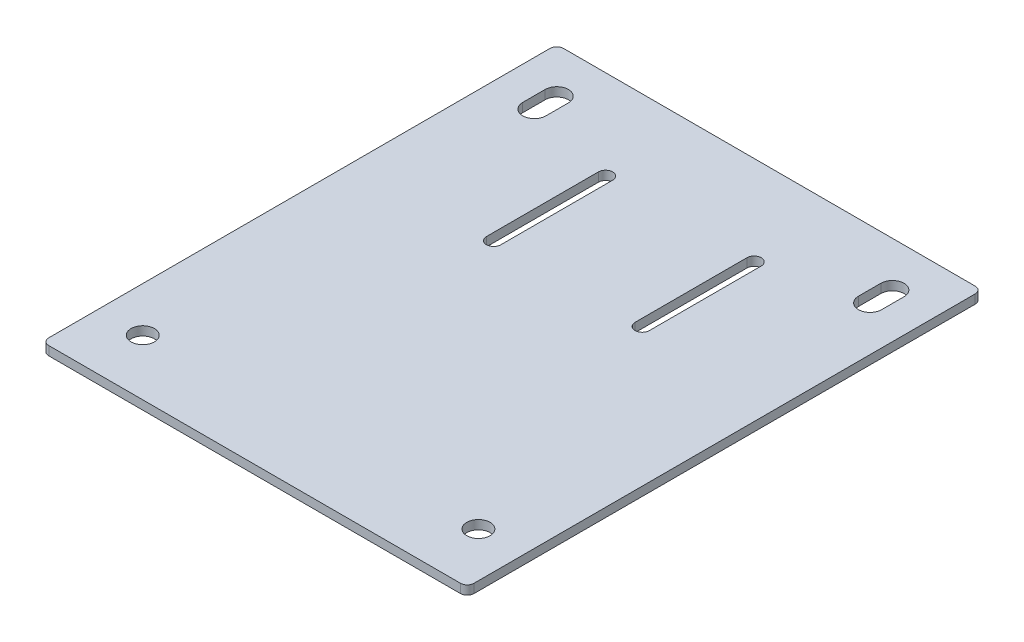
ISO-10303-21;
HEADER;
FILE_DESCRIPTION(('STEP AP214'),'2;1');
FILE_NAME('part.step','',(''),(''),'','','');
FILE_SCHEMA(('AUTOMOTIVE_DESIGN { 1 0 10303 214 1 1 1 1 }'));
ENDSEC;
DATA;
#1=APPLICATION_CONTEXT('core data for automotive mechanical design processes');
#2=APPLICATION_PROTOCOL_DEFINITION('international standard','automotive_design',2000,#1);
#3=PRODUCT_CONTEXT('',#1,'mechanical');
#4=PRODUCT('Part','Part','',(#3));
#5=PRODUCT_RELATED_PRODUCT_CATEGORY('part','',(#4));
#6=PRODUCT_DEFINITION_FORMATION('','',#4);
#7=PRODUCT_DEFINITION_CONTEXT('part definition',#1,'design');
#8=PRODUCT_DEFINITION('design','',#6,#7);
#9=PRODUCT_DEFINITION_SHAPE('','',#8);
#10=(LENGTH_UNIT() NAMED_UNIT(*) SI_UNIT(.MILLI.,.METRE.));
#11=(NAMED_UNIT(*) PLANE_ANGLE_UNIT() SI_UNIT($,.RADIAN.));
#12=(NAMED_UNIT(*) SI_UNIT($,.STERADIAN.) SOLID_ANGLE_UNIT());
#13=UNCERTAINTY_MEASURE_WITH_UNIT(LENGTH_MEASURE(1.E-05),#10,'distance_accuracy_value','');
#14=(GEOMETRIC_REPRESENTATION_CONTEXT(3) GLOBAL_UNCERTAINTY_ASSIGNED_CONTEXT((#13)) GLOBAL_UNIT_ASSIGNED_CONTEXT((#10,
#11,#12)) REPRESENTATION_CONTEXT('',''));
#15=CARTESIAN_POINT('',(0.,0.,0.));
#16=DIRECTION('',(0.,0.,1.));
#17=DIRECTION('',(1.,0.,0.));
#18=AXIS2_PLACEMENT_3D('',#15,#16,#17);
#19=CARTESIAN_POINT('',(0.,2.,0.));
#20=DIRECTION('',(0.,-1.,0.));
#21=DIRECTION('',(0.,0.,-1.));
#22=AXIS2_PLACEMENT_3D('',#19,#20,#21);
#23=PLANE('',#22);
#24=DIRECTION('',(0.,0.,-1.));
#25=VECTOR('',#24,1.);
#26=CARTESIAN_POINT('',(-18.2,2.,-37.5));
#27=LINE('',#26,#25);
#28=CARTESIAN_POINT('',(-18.2,2.,-12.5));
#29=VERTEX_POINT('',#28);
#30=CARTESIAN_POINT('',(-18.2,2.,-37.5));
#31=VERTEX_POINT('',#30);
#32=EDGE_CURVE('E202',#29,#31,#27,.T.);
#33=ORIENTED_EDGE('',*,*,#32,.T.);
#34=CARTESIAN_POINT('',(-16.6,2.,-37.5));
#35=DIRECTION('',(0.,-1.,0.));
#36=DIRECTION('',(0.,0.,1.));
#37=AXIS2_PLACEMENT_3D('',#34,#35,#36);
#38=CIRCLE('',#37,1.6);
#39=CARTESIAN_POINT('',(-15.,2.,-37.5));
#40=VERTEX_POINT('',#39);
#41=EDGE_CURVE('E196',#31,#40,#38,.T.);
#42=ORIENTED_EDGE('',*,*,#41,.T.);
#43=DIRECTION('',(0.,0.,1.));
#44=VECTOR('',#43,1.);
#45=CARTESIAN_POINT('',(-15.,2.,-37.5));
#46=LINE('',#45,#44);
#47=CARTESIAN_POINT('',(-15.,2.,-12.5));
#48=VERTEX_POINT('',#47);
#49=EDGE_CURVE('E205',#40,#48,#46,.T.);
#50=ORIENTED_EDGE('',*,*,#49,.T.);
#51=CARTESIAN_POINT('',(-16.6,2.,-12.5));
#52=DIRECTION('',(0.,-1.,0.));
#53=DIRECTION('',(0.,0.,1.));
#54=AXIS2_PLACEMENT_3D('',#51,#52,#53);
#55=CIRCLE('',#54,1.6);
#56=EDGE_CURVE('E48',#48,#29,#55,.T.);
#57=ORIENTED_EDGE('',*,*,#56,.T.);
#58=EDGE_LOOP('',(#33,#42,#50,#57));
#59=FACE_BOUND('',#58,.T.);
#60=DIRECTION('',(0.,0.,-1.));
#61=VECTOR('',#60,1.);
#62=CARTESIAN_POINT('',(15.,2.,-37.5));
#63=LINE('',#62,#61);
#64=CARTESIAN_POINT('',(15.,2.,-12.5));
#65=VERTEX_POINT('',#64);
#66=CARTESIAN_POINT('',(15.,2.,-37.5));
#67=VERTEX_POINT('',#66);
#68=EDGE_CURVE('E240',#65,#67,#63,.T.);
#69=ORIENTED_EDGE('',*,*,#68,.T.);
#70=CARTESIAN_POINT('',(16.6,2.,-37.5));
#71=DIRECTION('',(0.,-1.,0.));
#72=DIRECTION('',(0.,0.,-1.));
#73=AXIS2_PLACEMENT_3D('',#70,#71,#72);
#74=CIRCLE('',#73,1.6);
#75=CARTESIAN_POINT('',(18.2,2.,-37.5));
#76=VERTEX_POINT('',#75);
#77=EDGE_CURVE('E230',#67,#76,#74,.T.);
#78=ORIENTED_EDGE('',*,*,#77,.T.);
#79=DIRECTION('',(0.,0.,1.));
#80=VECTOR('',#79,1.);
#81=CARTESIAN_POINT('',(18.2,2.,-37.5));
#82=LINE('',#81,#80);
#83=CARTESIAN_POINT('',(18.2,2.,-12.5));
#84=VERTEX_POINT('',#83);
#85=EDGE_CURVE('E233',#76,#84,#82,.T.);
#86=ORIENTED_EDGE('',*,*,#85,.T.);
#87=CARTESIAN_POINT('',(16.6,2.,-12.5));
#88=DIRECTION('',(0.,-1.,0.));
#89=DIRECTION('',(0.,0.,-1.));
#90=AXIS2_PLACEMENT_3D('',#87,#88,#89);
#91=CIRCLE('',#90,1.6);
#92=EDGE_CURVE('E237',#84,#65,#91,.T.);
#93=ORIENTED_EDGE('',*,*,#92,.T.);
#94=EDGE_LOOP('',(#69,#78,#86,#93));
#95=FACE_BOUND('',#94,.T.);
#96=DIRECTION('',(1.,0.,0.));
#97=VECTOR('',#96,1.);
#98=CARTESIAN_POINT('',(-47.5,2.,57.5));
#99=LINE('',#98,#97);
#100=CARTESIAN_POINT('',(-46.,2.,57.5));
#101=VERTEX_POINT('',#100);
#102=CARTESIAN_POINT('',(46.,2.,57.5));
#103=VERTEX_POINT('',#102);
#104=EDGE_CURVE('E350',#101,#103,#99,.T.);
#105=ORIENTED_EDGE('',*,*,#104,.T.);
#106=CARTESIAN_POINT('',(46.,2.,56.));
#107=DIRECTION('',(0.,-1.,0.));
#108=DIRECTION('',(0.,0.,-1.));
#109=AXIS2_PLACEMENT_3D('',#106,#107,#108);
#110=CIRCLE('',#109,1.5);
#111=CARTESIAN_POINT('',(47.5,2.,56.));
#112=VERTEX_POINT('',#111);
#113=EDGE_CURVE('E387',#103,#112,#110,.F.);
#114=ORIENTED_EDGE('',*,*,#113,.T.);
#115=DIRECTION('',(0.,0.,-1.));
#116=VECTOR('',#115,1.);
#117=CARTESIAN_POINT('',(47.5,2.,57.5));
#118=LINE('',#117,#116);
#119=CARTESIAN_POINT('',(47.5,2.,-56.));
#120=VERTEX_POINT('',#119);
#121=EDGE_CURVE('E340',#112,#120,#118,.T.);
#122=ORIENTED_EDGE('',*,*,#121,.T.);
#123=CARTESIAN_POINT('',(46.,2.,-56.));
#124=DIRECTION('',(0.,-1.,0.));
#125=DIRECTION('',(0.,0.,-1.));
#126=AXIS2_PLACEMENT_3D('',#123,#124,#125);
#127=CIRCLE('',#126,1.5);
#128=CARTESIAN_POINT('',(46.,2.,-57.5));
#129=VERTEX_POINT('',#128);
#130=EDGE_CURVE('E383',#120,#129,#127,.F.);
#131=ORIENTED_EDGE('',*,*,#130,.T.);
#132=DIRECTION('',(-1.,0.,0.));
#133=VECTOR('',#132,1.);
#134=CARTESIAN_POINT('',(-47.5,2.,-57.5));
#135=LINE('',#134,#133);
#136=CARTESIAN_POINT('',(-46.,2.,-57.5));
#137=VERTEX_POINT('',#136);
#138=EDGE_CURVE('E343',#129,#137,#135,.T.);
#139=ORIENTED_EDGE('',*,*,#138,.T.);
#140=CARTESIAN_POINT('',(-46.,2.,-56.));
#141=DIRECTION('',(0.,-1.,0.));
#142=DIRECTION('',(0.,0.,-1.));
#143=AXIS2_PLACEMENT_3D('',#140,#141,#142);
#144=CIRCLE('',#143,1.5);
#145=CARTESIAN_POINT('',(-47.5,2.,-56.));
#146=VERTEX_POINT('',#145);
#147=EDGE_CURVE('E381',#137,#146,#144,.F.);
#148=ORIENTED_EDGE('',*,*,#147,.T.);
#149=DIRECTION('',(0.,0.,1.));
#150=VECTOR('',#149,1.);
#151=CARTESIAN_POINT('',(-47.5,2.,57.5));
#152=LINE('',#151,#150);
#153=CARTESIAN_POINT('',(-47.5,2.,56.));
#154=VERTEX_POINT('',#153);
#155=EDGE_CURVE('E347',#146,#154,#152,.T.);
#156=ORIENTED_EDGE('',*,*,#155,.T.);
#157=CARTESIAN_POINT('',(-46.,2.,56.));
#158=DIRECTION('',(0.,-1.,0.));
#159=DIRECTION('',(0.,0.,-1.));
#160=AXIS2_PLACEMENT_3D('',#157,#158,#159);
#161=CIRCLE('',#160,1.5);
#162=EDGE_CURVE('E385',#154,#101,#161,.F.);
#163=ORIENTED_EDGE('',*,*,#162,.T.);
#164=EDGE_LOOP('',(#105,#114,#122,#131,#139,#148,#156,#163));
#165=FACE_BOUND('',#164,.T.);
#166=DIRECTION('',(0.,0.,1.));
#167=VECTOR('',#166,1.);
#168=CARTESIAN_POINT('',(-40.1,2.,-47.5));
#169=LINE('',#168,#167);
#170=CARTESIAN_POINT('',(-40.1,2.,-47.5));
#171=VERTEX_POINT('',#170);
#172=CARTESIAN_POINT('',(-40.1,2.,-42.5));
#173=VERTEX_POINT('',#172);
#174=EDGE_CURVE('E310',#171,#173,#169,.T.);
#175=ORIENTED_EDGE('',*,*,#174,.F.);
#176=CARTESIAN_POINT('',(-37.5,2.,-47.5));
#177=DIRECTION('',(0.,1.,0.));
#178=DIRECTION('',(0.,0.,1.));
#179=AXIS2_PLACEMENT_3D('',#176,#177,#178);
#180=CIRCLE('',#179,2.6);
#181=CARTESIAN_POINT('',(-34.9,2.,-47.5));
#182=VERTEX_POINT('',#181);
#183=EDGE_CURVE('E287',#182,#171,#180,.T.);
#184=ORIENTED_EDGE('',*,*,#183,.F.);
#185=DIRECTION('',(0.,0.,-1.));
#186=VECTOR('',#185,1.);
#187=CARTESIAN_POINT('',(-34.9,2.,-47.5));
#188=LINE('',#187,#186);
#189=CARTESIAN_POINT('',(-34.9,2.,-42.5));
#190=VERTEX_POINT('',#189);
#191=EDGE_CURVE('E299',#190,#182,#188,.T.);
#192=ORIENTED_EDGE('',*,*,#191,.F.);
#193=CARTESIAN_POINT('',(-37.5,2.,-42.5));
#194=DIRECTION('',(0.,1.,0.));
#195=DIRECTION('',(0.,0.,1.));
#196=AXIS2_PLACEMENT_3D('',#193,#194,#195);
#197=CIRCLE('',#196,2.6);
#198=EDGE_CURVE('E312',#173,#190,#197,.T.);
#199=ORIENTED_EDGE('',*,*,#198,.F.);
#200=EDGE_LOOP('',(#175,#184,#192,#199));
#201=FACE_BOUND('',#200,.T.);
#202=DIRECTION('',(0.,0.,1.));
#203=VECTOR('',#202,1.);
#204=CARTESIAN_POINT('',(34.9,2.,-47.5));
#205=LINE('',#204,#203);
#206=CARTESIAN_POINT('',(34.9,2.,-47.5));
#207=VERTEX_POINT('',#206);
#208=CARTESIAN_POINT('',(34.9,2.,-42.5));
#209=VERTEX_POINT('',#208);
#210=EDGE_CURVE('E278',#207,#209,#205,.T.);
#211=ORIENTED_EDGE('',*,*,#210,.F.);
#212=CARTESIAN_POINT('',(37.5,2.,-47.5));
#213=DIRECTION('',(0.,1.,0.));
#214=DIRECTION('',(0.,0.,-1.));
#215=AXIS2_PLACEMENT_3D('',#212,#213,#214);
#216=CIRCLE('',#215,2.6);
#217=CARTESIAN_POINT('',(40.1,2.,-47.5));
#218=VERTEX_POINT('',#217);
#219=EDGE_CURVE('E255',#218,#207,#216,.T.);
#220=ORIENTED_EDGE('',*,*,#219,.F.);
#221=DIRECTION('',(0.,0.,-1.));
#222=VECTOR('',#221,1.);
#223=CARTESIAN_POINT('',(40.1,2.,-47.5));
#224=LINE('',#223,#222);
#225=CARTESIAN_POINT('',(40.1,2.,-42.5));
#226=VERTEX_POINT('',#225);
#227=EDGE_CURVE('E266',#226,#218,#224,.T.);
#228=ORIENTED_EDGE('',*,*,#227,.F.);
#229=CARTESIAN_POINT('',(37.5,2.,-42.5));
#230=DIRECTION('',(0.,1.,0.));
#231=DIRECTION('',(0.,0.,-1.));
#232=AXIS2_PLACEMENT_3D('',#229,#230,#231);
#233=CIRCLE('',#232,2.6);
#234=EDGE_CURVE('E280',#209,#226,#233,.T.);
#235=ORIENTED_EDGE('',*,*,#234,.F.);
#236=EDGE_LOOP('',(#211,#220,#228,#235));
#237=FACE_BOUND('',#236,.T.);
#238=CARTESIAN_POINT('',(37.5,2.,45.));
#239=DIRECTION('',(0.,1.,0.));
#240=DIRECTION('',(0.,0.,1.));
#241=AXIS2_PLACEMENT_3D('',#238,#239,#240);
#242=CIRCLE('',#241,2.6);
#243=CARTESIAN_POINT('',(37.5,2.,47.6));
#244=VERTEX_POINT('',#243);
#245=EDGE_CURVE('E334',#244,#244,#242,.T.);
#246=ORIENTED_EDGE('',*,*,#245,.F.);
#247=EDGE_LOOP('',(#246));
#248=FACE_BOUND('',#247,.T.);
#249=CARTESIAN_POINT('',(-37.5,2.,45.));
#250=DIRECTION('',(0.,1.,0.));
#251=DIRECTION('',(0.,0.,-1.));
#252=AXIS2_PLACEMENT_3D('',#249,#250,#251);
#253=CIRCLE('',#252,2.6);
#254=CARTESIAN_POINT('',(-37.5,2.,42.4));
#255=VERTEX_POINT('',#254);
#256=EDGE_CURVE('E328',#255,#255,#253,.T.);
#257=ORIENTED_EDGE('',*,*,#256,.F.);
#258=EDGE_LOOP('',(#257));
#259=FACE_BOUND('',#258,.T.);
#260=ADVANCED_FACE('F33',(#59,#95,#165,#201,#237,#248,#259),#23,.F.);
#261=CARTESIAN_POINT('',(0.,0.,0.));
#262=DIRECTION('',(0.,-1.,0.));
#263=DIRECTION('',(0.,0.,-1.));
#264=AXIS2_PLACEMENT_3D('',#261,#262,#263);
#265=PLANE('',#264);
#266=CARTESIAN_POINT('',(-16.6,0.,-37.5));
#267=DIRECTION('',(0.,-1.,0.));
#268=DIRECTION('',(0.,0.,1.));
#269=AXIS2_PLACEMENT_3D('',#266,#267,#268);
#270=CIRCLE('',#269,1.6);
#271=CARTESIAN_POINT('',(-18.2,0.,-37.5));
#272=VERTEX_POINT('',#271);
#273=CARTESIAN_POINT('',(-15.,0.,-37.5));
#274=VERTEX_POINT('',#273);
#275=EDGE_CURVE('E56',#272,#274,#270,.T.);
#276=ORIENTED_EDGE('',*,*,#275,.F.);
#277=DIRECTION('',(0.,0.,-1.));
#278=VECTOR('',#277,1.);
#279=CARTESIAN_POINT('',(-18.2,0.,-37.5));
#280=LINE('',#279,#278);
#281=CARTESIAN_POINT('',(-18.2,0.,-12.5));
#282=VERTEX_POINT('',#281);
#283=EDGE_CURVE('E211',#282,#272,#280,.T.);
#284=ORIENTED_EDGE('',*,*,#283,.F.);
#285=CARTESIAN_POINT('',(-16.6,0.,-12.5));
#286=DIRECTION('',(0.,-1.,0.));
#287=DIRECTION('',(0.,0.,1.));
#288=AXIS2_PLACEMENT_3D('',#285,#286,#287);
#289=CIRCLE('',#288,1.6);
#290=CARTESIAN_POINT('',(-15.,0.,-12.5));
#291=VERTEX_POINT('',#290);
#292=EDGE_CURVE('E214',#291,#282,#289,.T.);
#293=ORIENTED_EDGE('',*,*,#292,.F.);
#294=DIRECTION('',(0.,0.,1.));
#295=VECTOR('',#294,1.);
#296=CARTESIAN_POINT('',(-15.,0.,-37.5));
#297=LINE('',#296,#295);
#298=EDGE_CURVE('E220',#274,#291,#297,.T.);
#299=ORIENTED_EDGE('',*,*,#298,.F.);
#300=EDGE_LOOP('',(#276,#284,#293,#299));
#301=FACE_BOUND('',#300,.T.);
#302=CARTESIAN_POINT('',(16.6,0.,-37.5));
#303=DIRECTION('',(0.,-1.,0.));
#304=DIRECTION('',(0.,0.,-1.));
#305=AXIS2_PLACEMENT_3D('',#302,#303,#304);
#306=CIRCLE('',#305,1.6);
#307=CARTESIAN_POINT('',(15.,0.,-37.5));
#308=VERTEX_POINT('',#307);
#309=CARTESIAN_POINT('',(18.2,0.,-37.5));
#310=VERTEX_POINT('',#309);
#311=EDGE_CURVE('E226',#308,#310,#306,.T.);
#312=ORIENTED_EDGE('',*,*,#311,.F.);
#313=DIRECTION('',(0.,0.,-1.));
#314=VECTOR('',#313,1.);
#315=CARTESIAN_POINT('',(15.,0.,-37.5));
#316=LINE('',#315,#314);
#317=CARTESIAN_POINT('',(15.,0.,-12.5));
#318=VERTEX_POINT('',#317);
#319=EDGE_CURVE('E234',#318,#308,#316,.T.);
#320=ORIENTED_EDGE('',*,*,#319,.F.);
#321=CARTESIAN_POINT('',(16.6,0.,-12.5));
#322=DIRECTION('',(0.,-1.,0.));
#323=DIRECTION('',(0.,0.,-1.));
#324=AXIS2_PLACEMENT_3D('',#321,#322,#323);
#325=CIRCLE('',#324,1.6);
#326=CARTESIAN_POINT('',(18.2,0.,-12.5));
#327=VERTEX_POINT('',#326);
#328=EDGE_CURVE('E248',#327,#318,#325,.T.);
#329=ORIENTED_EDGE('',*,*,#328,.F.);
#330=DIRECTION('',(0.,0.,1.));
#331=VECTOR('',#330,1.);
#332=CARTESIAN_POINT('',(18.2,0.,-37.5));
#333=LINE('',#332,#331);
#334=EDGE_CURVE('E245',#310,#327,#333,.T.);
#335=ORIENTED_EDGE('',*,*,#334,.F.);
#336=EDGE_LOOP('',(#312,#320,#329,#335));
#337=FACE_BOUND('',#336,.T.);
#338=CARTESIAN_POINT('',(37.5,0.,-47.5));
#339=DIRECTION('',(0.,1.,0.));
#340=DIRECTION('',(0.,0.,-1.));
#341=AXIS2_PLACEMENT_3D('',#338,#339,#340);
#342=CIRCLE('',#341,2.6);
#343=CARTESIAN_POINT('',(40.1,0.,-47.5));
#344=VERTEX_POINT('',#343);
#345=CARTESIAN_POINT('',(34.9,0.,-47.5));
#346=VERTEX_POINT('',#345);
#347=EDGE_CURVE('E262',#344,#346,#342,.T.);
#348=ORIENTED_EDGE('',*,*,#347,.T.);
#349=DIRECTION('',(0.,0.,1.));
#350=VECTOR('',#349,1.);
#351=CARTESIAN_POINT('',(34.9,0.,-47.5));
#352=LINE('',#351,#350);
#353=CARTESIAN_POINT('',(34.9,0.,-42.5));
#354=VERTEX_POINT('',#353);
#355=EDGE_CURVE('E265',#346,#354,#352,.T.);
#356=ORIENTED_EDGE('',*,*,#355,.T.);
#357=CARTESIAN_POINT('',(37.5,0.,-42.5));
#358=DIRECTION('',(0.,1.,0.));
#359=DIRECTION('',(0.,0.,-1.));
#360=AXIS2_PLACEMENT_3D('',#357,#358,#359);
#361=CIRCLE('',#360,2.6);
#362=CARTESIAN_POINT('',(40.1,0.,-42.5));
#363=VERTEX_POINT('',#362);
#364=EDGE_CURVE('E269',#354,#363,#361,.T.);
#365=ORIENTED_EDGE('',*,*,#364,.T.);
#366=DIRECTION('',(0.,0.,-1.));
#367=VECTOR('',#366,1.);
#368=CARTESIAN_POINT('',(40.1,0.,-47.5));
#369=LINE('',#368,#367);
#370=EDGE_CURVE('E272',#363,#344,#369,.T.);
#371=ORIENTED_EDGE('',*,*,#370,.T.);
#372=EDGE_LOOP('',(#348,#356,#365,#371));
#373=FACE_BOUND('',#372,.T.);
#374=CARTESIAN_POINT('',(-37.5,0.,-47.5));
#375=DIRECTION('',(0.,1.,0.));
#376=DIRECTION('',(0.,0.,1.));
#377=AXIS2_PLACEMENT_3D('',#374,#375,#376);
#378=CIRCLE('',#377,2.6);
#379=CARTESIAN_POINT('',(-34.9,0.,-47.5));
#380=VERTEX_POINT('',#379);
#381=CARTESIAN_POINT('',(-40.1,0.,-47.5));
#382=VERTEX_POINT('',#381);
#383=EDGE_CURVE('E295',#380,#382,#378,.T.);
#384=ORIENTED_EDGE('',*,*,#383,.T.);
#385=DIRECTION('',(0.,0.,1.));
#386=VECTOR('',#385,1.);
#387=CARTESIAN_POINT('',(-40.1,0.,-47.5));
#388=LINE('',#387,#386);
#389=CARTESIAN_POINT('',(-40.1,0.,-42.5));
#390=VERTEX_POINT('',#389);
#391=EDGE_CURVE('E298',#382,#390,#388,.T.);
#392=ORIENTED_EDGE('',*,*,#391,.T.);
#393=CARTESIAN_POINT('',(-37.5,0.,-42.5));
#394=DIRECTION('',(0.,1.,0.));
#395=DIRECTION('',(0.,0.,1.));
#396=AXIS2_PLACEMENT_3D('',#393,#394,#395);
#397=CIRCLE('',#396,2.6);
#398=CARTESIAN_POINT('',(-34.9,0.,-42.5));
#399=VERTEX_POINT('',#398);
#400=EDGE_CURVE('E302',#390,#399,#397,.T.);
#401=ORIENTED_EDGE('',*,*,#400,.T.);
#402=DIRECTION('',(0.,0.,-1.));
#403=VECTOR('',#402,1.);
#404=CARTESIAN_POINT('',(-34.9,0.,-47.5));
#405=LINE('',#404,#403);
#406=EDGE_CURVE('E305',#399,#380,#405,.T.);
#407=ORIENTED_EDGE('',*,*,#406,.T.);
#408=EDGE_LOOP('',(#384,#392,#401,#407));
#409=FACE_BOUND('',#408,.T.);
#410=CARTESIAN_POINT('',(37.5,0.,45.));
#411=DIRECTION('',(0.,1.,0.));
#412=DIRECTION('',(0.,0.,1.));
#413=AXIS2_PLACEMENT_3D('',#410,#411,#412);
#414=CIRCLE('',#413,2.6);
#415=CARTESIAN_POINT('',(37.5,0.,47.6));
#416=VERTEX_POINT('',#415);
#417=EDGE_CURVE('E331',#416,#416,#414,.T.);
#418=ORIENTED_EDGE('',*,*,#417,.T.);
#419=EDGE_LOOP('',(#418));
#420=FACE_BOUND('',#419,.T.);
#421=DIRECTION('',(0.,0.,-1.));
#422=VECTOR('',#421,1.);
#423=CARTESIAN_POINT('',(47.5,0.,57.5));
#424=LINE('',#423,#422);
#425=CARTESIAN_POINT('',(47.5,0.,56.));
#426=VERTEX_POINT('',#425);
#427=CARTESIAN_POINT('',(47.5,0.,-56.));
#428=VERTEX_POINT('',#427);
#429=EDGE_CURVE('E337',#426,#428,#424,.T.);
#430=ORIENTED_EDGE('',*,*,#429,.F.);
#431=CARTESIAN_POINT('',(46.,0.,56.));
#432=DIRECTION('',(0.,-1.,0.));
#433=DIRECTION('',(0.,0.,-1.));
#434=AXIS2_PLACEMENT_3D('',#431,#432,#433);
#435=CIRCLE('',#434,1.5);
#436=CARTESIAN_POINT('',(46.,0.,57.5));
#437=VERTEX_POINT('',#436);
#438=EDGE_CURVE('E374',#426,#437,#435,.T.);
#439=ORIENTED_EDGE('',*,*,#438,.T.);
#440=DIRECTION('',(1.,0.,0.));
#441=VECTOR('',#440,1.);
#442=CARTESIAN_POINT('',(-47.5,0.,57.5));
#443=LINE('',#442,#441);
#444=CARTESIAN_POINT('',(-46.,0.,57.5));
#445=VERTEX_POINT('',#444);
#446=EDGE_CURVE('E344',#445,#437,#443,.T.);
#447=ORIENTED_EDGE('',*,*,#446,.F.);
#448=CARTESIAN_POINT('',(-46.,0.,56.));
#449=DIRECTION('',(0.,-1.,0.));
#450=DIRECTION('',(0.,0.,-1.));
#451=AXIS2_PLACEMENT_3D('',#448,#449,#450);
#452=CIRCLE('',#451,1.5);
#453=CARTESIAN_POINT('',(-47.5,0.,56.));
#454=VERTEX_POINT('',#453);
#455=EDGE_CURVE('E372',#445,#454,#452,.T.);
#456=ORIENTED_EDGE('',*,*,#455,.T.);
#457=DIRECTION('',(0.,0.,1.));
#458=VECTOR('',#457,1.);
#459=CARTESIAN_POINT('',(-47.5,0.,57.5));
#460=LINE('',#459,#458);
#461=CARTESIAN_POINT('',(-47.5,0.,-56.));
#462=VERTEX_POINT('',#461);
#463=EDGE_CURVE('E359',#462,#454,#460,.T.);
#464=ORIENTED_EDGE('',*,*,#463,.F.);
#465=CARTESIAN_POINT('',(-46.,0.,-56.));
#466=DIRECTION('',(0.,-1.,0.));
#467=DIRECTION('',(0.,0.,-1.));
#468=AXIS2_PLACEMENT_3D('',#465,#466,#467);
#469=CIRCLE('',#468,1.5);
#470=CARTESIAN_POINT('',(-46.,0.,-57.5));
#471=VERTEX_POINT('',#470);
#472=EDGE_CURVE('E368',#462,#471,#469,.T.);
#473=ORIENTED_EDGE('',*,*,#472,.T.);
#474=DIRECTION('',(-1.,0.,0.));
#475=VECTOR('',#474,1.);
#476=CARTESIAN_POINT('',(-47.5,0.,-57.5));
#477=LINE('',#476,#475);
#478=CARTESIAN_POINT('',(46.,0.,-57.5));
#479=VERTEX_POINT('',#478);
#480=EDGE_CURVE('E356',#479,#471,#477,.T.);
#481=ORIENTED_EDGE('',*,*,#480,.F.);
#482=CARTESIAN_POINT('',(46.,0.,-56.));
#483=DIRECTION('',(0.,-1.,0.));
#484=DIRECTION('',(0.,0.,-1.));
#485=AXIS2_PLACEMENT_3D('',#482,#483,#484);
#486=CIRCLE('',#485,1.5);
#487=EDGE_CURVE('E370',#479,#428,#486,.T.);
#488=ORIENTED_EDGE('',*,*,#487,.T.);
#489=EDGE_LOOP('',(#430,#439,#447,#456,#464,#473,#481,#488));
#490=FACE_BOUND('',#489,.T.);
#491=CARTESIAN_POINT('',(-37.5,0.,45.));
#492=DIRECTION('',(0.,1.,0.));
#493=DIRECTION('',(0.,0.,-1.));
#494=AXIS2_PLACEMENT_3D('',#491,#492,#493);
#495=CIRCLE('',#494,2.6);
#496=CARTESIAN_POINT('',(-37.5,0.,42.4));
#497=VERTEX_POINT('',#496);
#498=EDGE_CURVE('E319',#497,#497,#495,.T.);
#499=ORIENTED_EDGE('',*,*,#498,.T.);
#500=EDGE_LOOP('',(#499));
#501=FACE_BOUND('',#500,.T.);
#502=ADVANCED_FACE('F412',(#301,#337,#373,#409,#420,#490,#501),#265,.T.);
#503=CARTESIAN_POINT('',(47.5,2.,57.5));
#504=DIRECTION('',(-1.,0.,0.));
#505=DIRECTION('',(0.,0.,1.));
#506=AXIS2_PLACEMENT_3D('',#503,#504,#505);
#507=PLANE('',#506);
#508=ORIENTED_EDGE('',*,*,#121,.F.);
#509=DIRECTION('',(0.,-1.,0.));
#510=VECTOR('',#509,1.);
#511=CARTESIAN_POINT('',(47.5,2.,56.));
#512=LINE('',#511,#510);
#513=EDGE_CURVE('E365',#112,#426,#512,.T.);
#514=ORIENTED_EDGE('',*,*,#513,.T.);
#515=ORIENTED_EDGE('',*,*,#429,.T.);
#516=DIRECTION('',(0.,-1.,0.));
#517=VECTOR('',#516,1.);
#518=CARTESIAN_POINT('',(47.5,2.,-56.));
#519=LINE('',#518,#517);
#520=EDGE_CURVE('E353',#428,#120,#519,.F.);
#521=ORIENTED_EDGE('',*,*,#520,.T.);
#522=EDGE_LOOP('',(#508,#514,#515,#521));
#523=FACE_BOUND('',#522,.T.);
#524=ADVANCED_FACE('F429',(#523),#507,.F.);
#525=CARTESIAN_POINT('',(-47.5,2.,-57.5));
#526=DIRECTION('',(0.,0.,1.));
#527=DIRECTION('',(1.,0.,0.));
#528=AXIS2_PLACEMENT_3D('',#525,#526,#527);
#529=PLANE('',#528);
#530=ORIENTED_EDGE('',*,*,#138,.F.);
#531=DIRECTION('',(0.,-1.,0.));
#532=VECTOR('',#531,1.);
#533=CARTESIAN_POINT('',(46.,2.,-57.5));
#534=LINE('',#533,#532);
#535=EDGE_CURVE('E11',#129,#479,#534,.T.);
#536=ORIENTED_EDGE('',*,*,#535,.T.);
#537=ORIENTED_EDGE('',*,*,#480,.T.);
#538=DIRECTION('',(0.,-1.,0.));
#539=VECTOR('',#538,1.);
#540=CARTESIAN_POINT('',(-46.,2.,-57.5));
#541=LINE('',#540,#539);
#542=EDGE_CURVE('E41',#471,#137,#541,.F.);
#543=ORIENTED_EDGE('',*,*,#542,.T.);
#544=EDGE_LOOP('',(#530,#536,#537,#543));
#545=FACE_BOUND('',#544,.T.);
#546=ADVANCED_FACE('F396',(#545),#529,.F.);
#547=CARTESIAN_POINT('',(-47.5,2.,57.5));
#548=DIRECTION('',(1.,0.,0.));
#549=DIRECTION('',(0.,0.,-1.));
#550=AXIS2_PLACEMENT_3D('',#547,#548,#549);
#551=PLANE('',#550);
#552=ORIENTED_EDGE('',*,*,#463,.T.);
#553=DIRECTION('',(0.,-1.,0.));
#554=VECTOR('',#553,1.);
#555=CARTESIAN_POINT('',(-47.5,2.,56.));
#556=LINE('',#555,#554);
#557=EDGE_CURVE('E392',#454,#154,#556,.F.);
#558=ORIENTED_EDGE('',*,*,#557,.T.);
#559=ORIENTED_EDGE('',*,*,#155,.F.);
#560=DIRECTION('',(0.,-1.,0.));
#561=VECTOR('',#560,1.);
#562=CARTESIAN_POINT('',(-47.5,2.,-56.));
#563=LINE('',#562,#561);
#564=EDGE_CURVE('E389',#146,#462,#563,.T.);
#565=ORIENTED_EDGE('',*,*,#564,.T.);
#566=EDGE_LOOP('',(#552,#558,#559,#565));
#567=FACE_BOUND('',#566,.T.);
#568=ADVANCED_FACE('F408',(#567),#551,.F.);
#569=CARTESIAN_POINT('',(-47.5,2.,57.5));
#570=DIRECTION('',(0.,0.,-1.));
#571=DIRECTION('',(-1.,0.,0.));
#572=AXIS2_PLACEMENT_3D('',#569,#570,#571);
#573=PLANE('',#572);
#574=ORIENTED_EDGE('',*,*,#446,.T.);
#575=DIRECTION('',(0.,-1.,0.));
#576=VECTOR('',#575,1.);
#577=CARTESIAN_POINT('',(46.,2.,57.5));
#578=LINE('',#577,#576);
#579=EDGE_CURVE('E379',#437,#103,#578,.F.);
#580=ORIENTED_EDGE('',*,*,#579,.T.);
#581=ORIENTED_EDGE('',*,*,#104,.F.);
#582=DIRECTION('',(0.,-1.,0.));
#583=VECTOR('',#582,1.);
#584=CARTESIAN_POINT('',(-46.,2.,57.5));
#585=LINE('',#584,#583);
#586=EDGE_CURVE('E376',#101,#445,#585,.T.);
#587=ORIENTED_EDGE('',*,*,#586,.T.);
#588=EDGE_LOOP('',(#574,#580,#581,#587));
#589=FACE_BOUND('',#588,.T.);
#590=ADVANCED_FACE('F421',(#589),#573,.F.);
#591=CARTESIAN_POINT('',(37.5,2.,45.));
#592=DIRECTION('',(0.,-1.,0.));
#593=DIRECTION('',(0.,0.,-1.));
#594=AXIS2_PLACEMENT_3D('',#591,#592,#593);
#595=CYLINDRICAL_SURFACE('',#594,2.6);
#596=ORIENTED_EDGE('',*,*,#245,.T.);
#597=EDGE_LOOP('',(#596));
#598=FACE_BOUND('',#597,.T.);
#599=ORIENTED_EDGE('',*,*,#417,.F.);
#600=EDGE_LOOP('',(#599));
#601=FACE_BOUND('',#600,.T.);
#602=ADVANCED_FACE('F448',(#598,#601),#595,.F.);
#603=CARTESIAN_POINT('',(-37.5,2.,45.));
#604=DIRECTION('',(0.,-1.,0.));
#605=DIRECTION('',(0.,0.,-1.));
#606=AXIS2_PLACEMENT_3D('',#603,#604,#605);
#607=CYLINDRICAL_SURFACE('',#606,2.6);
#608=ORIENTED_EDGE('',*,*,#256,.T.);
#609=EDGE_LOOP('',(#608));
#610=FACE_BOUND('',#609,.T.);
#611=ORIENTED_EDGE('',*,*,#498,.F.);
#612=EDGE_LOOP('',(#611));
#613=FACE_BOUND('',#612,.T.);
#614=ADVANCED_FACE('F484',(#610,#613),#607,.F.);
#615=CARTESIAN_POINT('',(-34.9,0.,-47.5));
#616=DIRECTION('',(1.,0.,0.));
#617=DIRECTION('',(0.,0.,-1.));
#618=AXIS2_PLACEMENT_3D('',#615,#616,#617);
#619=PLANE('',#618);
#620=ORIENTED_EDGE('',*,*,#191,.T.);
#621=DIRECTION('',(0.,1.,0.));
#622=VECTOR('',#621,1.);
#623=CARTESIAN_POINT('',(-34.9,0.,-47.5));
#624=LINE('',#623,#622);
#625=EDGE_CURVE('E316',#380,#182,#624,.T.);
#626=ORIENTED_EDGE('',*,*,#625,.F.);
#627=ORIENTED_EDGE('',*,*,#406,.F.);
#628=DIRECTION('',(0.,1.,0.));
#629=VECTOR('',#628,1.);
#630=CARTESIAN_POINT('',(-34.9,0.,-42.5));
#631=LINE('',#630,#629);
#632=EDGE_CURVE('E320',#399,#190,#631,.T.);
#633=ORIENTED_EDGE('',*,*,#632,.T.);
#634=EDGE_LOOP('',(#620,#626,#627,#633));
#635=FACE_BOUND('',#634,.T.);
#636=ADVANCED_FACE('F480',(#635),#619,.F.);
#637=CARTESIAN_POINT('',(-40.1,0.,-47.5));
#638=DIRECTION('',(-1.,0.,0.));
#639=DIRECTION('',(0.,0.,1.));
#640=AXIS2_PLACEMENT_3D('',#637,#638,#639);
#641=PLANE('',#640);
#642=ORIENTED_EDGE('',*,*,#174,.T.);
#643=DIRECTION('',(0.,1.,0.));
#644=VECTOR('',#643,1.);
#645=CARTESIAN_POINT('',(-40.1,0.,-42.5));
#646=LINE('',#645,#644);
#647=EDGE_CURVE('E323',#390,#173,#646,.T.);
#648=ORIENTED_EDGE('',*,*,#647,.F.);
#649=ORIENTED_EDGE('',*,*,#391,.F.);
#650=DIRECTION('',(0.,1.,0.));
#651=VECTOR('',#650,1.);
#652=CARTESIAN_POINT('',(-40.1,0.,-47.5));
#653=LINE('',#652,#651);
#654=EDGE_CURVE('E308',#382,#171,#653,.T.);
#655=ORIENTED_EDGE('',*,*,#654,.T.);
#656=EDGE_LOOP('',(#642,#648,#649,#655));
#657=FACE_BOUND('',#656,.T.);
#658=ADVANCED_FACE('F483',(#657),#641,.F.);
#659=CARTESIAN_POINT('',(-37.5,0.,-47.5));
#660=DIRECTION('',(0.,1.,0.));
#661=DIRECTION('',(0.,0.,1.));
#662=AXIS2_PLACEMENT_3D('',#659,#660,#661);
#663=CYLINDRICAL_SURFACE('',#662,2.6);
#664=ORIENTED_EDGE('',*,*,#183,.T.);
#665=ORIENTED_EDGE('',*,*,#654,.F.);
#666=ORIENTED_EDGE('',*,*,#383,.F.);
#667=ORIENTED_EDGE('',*,*,#625,.T.);
#668=EDGE_LOOP('',(#664,#665,#666,#667));
#669=FACE_BOUND('',#668,.T.);
#670=ADVANCED_FACE('F489',(#669),#663,.F.);
#671=CARTESIAN_POINT('',(-37.5,0.,-42.5));
#672=DIRECTION('',(0.,1.,0.));
#673=DIRECTION('',(0.,0.,1.));
#674=AXIS2_PLACEMENT_3D('',#671,#672,#673);
#675=CYLINDRICAL_SURFACE('',#674,2.6);
#676=ORIENTED_EDGE('',*,*,#198,.T.);
#677=ORIENTED_EDGE('',*,*,#632,.F.);
#678=ORIENTED_EDGE('',*,*,#400,.F.);
#679=ORIENTED_EDGE('',*,*,#647,.T.);
#680=EDGE_LOOP('',(#676,#677,#678,#679));
#681=FACE_BOUND('',#680,.T.);
#682=ADVANCED_FACE('F486',(#681),#675,.F.);
#683=CARTESIAN_POINT('',(40.1,0.,-47.5));
#684=DIRECTION('',(1.,0.,0.));
#685=DIRECTION('',(0.,0.,-1.));
#686=AXIS2_PLACEMENT_3D('',#683,#684,#685);
#687=PLANE('',#686);
#688=ORIENTED_EDGE('',*,*,#227,.T.);
#689=DIRECTION('',(0.,1.,0.));
#690=VECTOR('',#689,1.);
#691=CARTESIAN_POINT('',(40.1,0.,-47.5));
#692=LINE('',#691,#690);
#693=EDGE_CURVE('E284',#344,#218,#692,.T.);
#694=ORIENTED_EDGE('',*,*,#693,.F.);
#695=ORIENTED_EDGE('',*,*,#370,.F.);
#696=DIRECTION('',(0.,1.,0.));
#697=VECTOR('',#696,1.);
#698=CARTESIAN_POINT('',(40.1,0.,-42.5));
#699=LINE('',#698,#697);
#700=EDGE_CURVE('E288',#363,#226,#699,.T.);
#701=ORIENTED_EDGE('',*,*,#700,.T.);
#702=EDGE_LOOP('',(#688,#694,#695,#701));
#703=FACE_BOUND('',#702,.T.);
#704=ADVANCED_FACE('F475',(#703),#687,.F.);
#705=CARTESIAN_POINT('',(34.9,0.,-47.5));
#706=DIRECTION('',(-1.,0.,0.));
#707=DIRECTION('',(0.,0.,1.));
#708=AXIS2_PLACEMENT_3D('',#705,#706,#707);
#709=PLANE('',#708);
#710=ORIENTED_EDGE('',*,*,#210,.T.);
#711=DIRECTION('',(0.,1.,0.));
#712=VECTOR('',#711,1.);
#713=CARTESIAN_POINT('',(34.9,0.,-42.5));
#714=LINE('',#713,#712);
#715=EDGE_CURVE('E290',#354,#209,#714,.T.);
#716=ORIENTED_EDGE('',*,*,#715,.F.);
#717=ORIENTED_EDGE('',*,*,#355,.F.);
#718=DIRECTION('',(0.,1.,0.));
#719=VECTOR('',#718,1.);
#720=CARTESIAN_POINT('',(34.9,0.,-47.5));
#721=LINE('',#720,#719);
#722=EDGE_CURVE('E275',#346,#207,#721,.T.);
#723=ORIENTED_EDGE('',*,*,#722,.T.);
#724=EDGE_LOOP('',(#710,#716,#717,#723));
#725=FACE_BOUND('',#724,.T.);
#726=ADVANCED_FACE('F470',(#725),#709,.F.);
#727=CARTESIAN_POINT('',(37.5,0.,-47.5));
#728=DIRECTION('',(0.,1.,0.));
#729=DIRECTION('',(0.,0.,1.));
#730=AXIS2_PLACEMENT_3D('',#727,#728,#729);
#731=CYLINDRICAL_SURFACE('',#730,2.6);
#732=ORIENTED_EDGE('',*,*,#219,.T.);
#733=ORIENTED_EDGE('',*,*,#722,.F.);
#734=ORIENTED_EDGE('',*,*,#347,.F.);
#735=ORIENTED_EDGE('',*,*,#693,.T.);
#736=EDGE_LOOP('',(#732,#733,#734,#735));
#737=FACE_BOUND('',#736,.T.);
#738=ADVANCED_FACE('F464',(#737),#731,.F.);
#739=CARTESIAN_POINT('',(37.5,0.,-42.5));
#740=DIRECTION('',(0.,1.,0.));
#741=DIRECTION('',(0.,0.,1.));
#742=AXIS2_PLACEMENT_3D('',#739,#740,#741);
#743=CYLINDRICAL_SURFACE('',#742,2.6);
#744=ORIENTED_EDGE('',*,*,#234,.T.);
#745=ORIENTED_EDGE('',*,*,#700,.F.);
#746=ORIENTED_EDGE('',*,*,#364,.F.);
#747=ORIENTED_EDGE('',*,*,#715,.T.);
#748=EDGE_LOOP('',(#744,#745,#746,#747));
#749=FACE_BOUND('',#748,.T.);
#750=ADVANCED_FACE('F460',(#749),#743,.F.);
#751=CARTESIAN_POINT('',(46.,2.,56.));
#752=DIRECTION('',(0.,-1.,0.));
#753=DIRECTION('',(0.,0.,-1.));
#754=AXIS2_PLACEMENT_3D('',#751,#752,#753);
#755=CYLINDRICAL_SURFACE('',#754,1.5);
#756=ORIENTED_EDGE('',*,*,#113,.F.);
#757=ORIENTED_EDGE('',*,*,#579,.F.);
#758=ORIENTED_EDGE('',*,*,#438,.F.);
#759=ORIENTED_EDGE('',*,*,#513,.F.);
#760=EDGE_LOOP('',(#756,#757,#758,#759));
#761=FACE_BOUND('',#760,.T.);
#762=ADVANCED_FACE('F427',(#761),#755,.T.);
#763=CARTESIAN_POINT('',(-46.,2.,56.));
#764=DIRECTION('',(0.,-1.,0.));
#765=DIRECTION('',(0.,0.,-1.));
#766=AXIS2_PLACEMENT_3D('',#763,#764,#765);
#767=CYLINDRICAL_SURFACE('',#766,1.5);
#768=ORIENTED_EDGE('',*,*,#162,.F.);
#769=ORIENTED_EDGE('',*,*,#557,.F.);
#770=ORIENTED_EDGE('',*,*,#455,.F.);
#771=ORIENTED_EDGE('',*,*,#586,.F.);
#772=EDGE_LOOP('',(#768,#769,#770,#771));
#773=FACE_BOUND('',#772,.T.);
#774=ADVANCED_FACE('F418',(#773),#767,.T.);
#775=CARTESIAN_POINT('',(46.,2.,-56.));
#776=DIRECTION('',(0.,-1.,0.));
#777=DIRECTION('',(0.,0.,-1.));
#778=AXIS2_PLACEMENT_3D('',#775,#776,#777);
#779=CYLINDRICAL_SURFACE('',#778,1.5);
#780=ORIENTED_EDGE('',*,*,#130,.F.);
#781=ORIENTED_EDGE('',*,*,#520,.F.);
#782=ORIENTED_EDGE('',*,*,#487,.F.);
#783=ORIENTED_EDGE('',*,*,#535,.F.);
#784=EDGE_LOOP('',(#780,#781,#782,#783));
#785=FACE_BOUND('',#784,.T.);
#786=ADVANCED_FACE('F432',(#785),#779,.T.);
#787=CARTESIAN_POINT('',(-46.,2.,-56.));
#788=DIRECTION('',(0.,-1.,0.));
#789=DIRECTION('',(0.,0.,-1.));
#790=AXIS2_PLACEMENT_3D('',#787,#788,#789);
#791=CYLINDRICAL_SURFACE('',#790,1.5);
#792=ORIENTED_EDGE('',*,*,#147,.F.);
#793=ORIENTED_EDGE('',*,*,#542,.F.);
#794=ORIENTED_EDGE('',*,*,#472,.F.);
#795=ORIENTED_EDGE('',*,*,#564,.F.);
#796=EDGE_LOOP('',(#792,#793,#794,#795));
#797=FACE_BOUND('',#796,.T.);
#798=ADVANCED_FACE('F35',(#797),#791,.T.);
#799=CARTESIAN_POINT('',(16.6,2.,-37.5));
#800=DIRECTION('',(0.,-1.,0.));
#801=DIRECTION('',(0.,0.,-1.));
#802=AXIS2_PLACEMENT_3D('',#799,#800,#801);
#803=CYLINDRICAL_SURFACE('',#802,1.6);
#804=ORIENTED_EDGE('',*,*,#311,.T.);
#805=DIRECTION('',(0.,-1.,0.));
#806=VECTOR('',#805,1.);
#807=CARTESIAN_POINT('',(18.2,2.,-37.5));
#808=LINE('',#807,#806);
#809=EDGE_CURVE('E243',#76,#310,#808,.T.);
#810=ORIENTED_EDGE('',*,*,#809,.F.);
#811=ORIENTED_EDGE('',*,*,#77,.F.);
#812=DIRECTION('',(0.,-1.,0.));
#813=VECTOR('',#812,1.);
#814=CARTESIAN_POINT('',(15.,2.,-37.5));
#815=LINE('',#814,#813);
#816=EDGE_CURVE('E253',#67,#308,#815,.T.);
#817=ORIENTED_EDGE('',*,*,#816,.T.);
#818=EDGE_LOOP('',(#804,#810,#811,#817));
#819=FACE_BOUND('',#818,.T.);
#820=ADVANCED_FACE('F438',(#819),#803,.F.);
#821=CARTESIAN_POINT('',(15.,2.,-37.5));
#822=DIRECTION('',(-1.,0.,0.));
#823=DIRECTION('',(0.,0.,1.));
#824=AXIS2_PLACEMENT_3D('',#821,#822,#823);
#825=PLANE('',#824);
#826=ORIENTED_EDGE('',*,*,#319,.T.);
#827=ORIENTED_EDGE('',*,*,#816,.F.);
#828=ORIENTED_EDGE('',*,*,#68,.F.);
#829=DIRECTION('',(0.,-1.,0.));
#830=VECTOR('',#829,1.);
#831=CARTESIAN_POINT('',(15.,2.,-12.5));
#832=LINE('',#831,#830);
#833=EDGE_CURVE('E256',#65,#318,#832,.T.);
#834=ORIENTED_EDGE('',*,*,#833,.T.);
#835=EDGE_LOOP('',(#826,#827,#828,#834));
#836=FACE_BOUND('',#835,.T.);
#837=ADVANCED_FACE('F545',(#836),#825,.F.);
#838=CARTESIAN_POINT('',(16.6,2.,-12.5));
#839=DIRECTION('',(0.,-1.,0.));
#840=DIRECTION('',(0.,0.,-1.));
#841=AXIS2_PLACEMENT_3D('',#838,#839,#840);
#842=CYLINDRICAL_SURFACE('',#841,1.6);
#843=ORIENTED_EDGE('',*,*,#328,.T.);
#844=ORIENTED_EDGE('',*,*,#833,.F.);
#845=ORIENTED_EDGE('',*,*,#92,.F.);
#846=DIRECTION('',(0.,-1.,0.));
#847=VECTOR('',#846,1.);
#848=CARTESIAN_POINT('',(18.2,2.,-12.5));
#849=LINE('',#848,#847);
#850=EDGE_CURVE('E258',#84,#327,#849,.T.);
#851=ORIENTED_EDGE('',*,*,#850,.T.);
#852=EDGE_LOOP('',(#843,#844,#845,#851));
#853=FACE_BOUND('',#852,.T.);
#854=ADVANCED_FACE('F555',(#853),#842,.F.);
#855=CARTESIAN_POINT('',(18.2,2.,-37.5));
#856=DIRECTION('',(1.,0.,0.));
#857=DIRECTION('',(0.,0.,-1.));
#858=AXIS2_PLACEMENT_3D('',#855,#856,#857);
#859=PLANE('',#858);
#860=ORIENTED_EDGE('',*,*,#334,.T.);
#861=ORIENTED_EDGE('',*,*,#850,.F.);
#862=ORIENTED_EDGE('',*,*,#85,.F.);
#863=ORIENTED_EDGE('',*,*,#809,.T.);
#864=EDGE_LOOP('',(#860,#861,#862,#863));
#865=FACE_BOUND('',#864,.T.);
#866=ADVANCED_FACE('F565',(#865),#859,.F.);
#867=CARTESIAN_POINT('',(-16.6,2.,-37.5));
#868=DIRECTION('',(0.,-1.,0.));
#869=DIRECTION('',(0.,0.,-1.));
#870=AXIS2_PLACEMENT_3D('',#867,#868,#869);
#871=CYLINDRICAL_SURFACE('',#870,1.6);
#872=ORIENTED_EDGE('',*,*,#275,.T.);
#873=DIRECTION('',(0.,-1.,0.));
#874=VECTOR('',#873,1.);
#875=CARTESIAN_POINT('',(-15.,2.,-37.5));
#876=LINE('',#875,#874);
#877=EDGE_CURVE('E192',#40,#274,#876,.T.);
#878=ORIENTED_EDGE('',*,*,#877,.F.);
#879=ORIENTED_EDGE('',*,*,#41,.F.);
#880=DIRECTION('',(0.,-1.,0.));
#881=VECTOR('',#880,1.);
#882=CARTESIAN_POINT('',(-18.2,2.,-37.5));
#883=LINE('',#882,#881);
#884=EDGE_CURVE('E224',#31,#272,#883,.T.);
#885=ORIENTED_EDGE('',*,*,#884,.T.);
#886=EDGE_LOOP('',(#872,#878,#879,#885));
#887=FACE_BOUND('',#886,.T.);
#888=ADVANCED_FACE('F194',(#887),#871,.F.);
#889=CARTESIAN_POINT('',(-18.2,2.,-37.5));
#890=DIRECTION('',(-1.,0.,0.));
#891=DIRECTION('',(0.,0.,1.));
#892=AXIS2_PLACEMENT_3D('',#889,#890,#891);
#893=PLANE('',#892);
#894=ORIENTED_EDGE('',*,*,#283,.T.);
#895=ORIENTED_EDGE('',*,*,#884,.F.);
#896=ORIENTED_EDGE('',*,*,#32,.F.);
#897=DIRECTION('',(0.,-1.,0.));
#898=VECTOR('',#897,1.);
#899=CARTESIAN_POINT('',(-18.2,2.,-12.5));
#900=LINE('',#899,#898);
#901=EDGE_CURVE('E227',#29,#282,#900,.T.);
#902=ORIENTED_EDGE('',*,*,#901,.T.);
#903=EDGE_LOOP('',(#894,#895,#896,#902));
#904=FACE_BOUND('',#903,.T.);
#905=ADVANCED_FACE('F584',(#904),#893,.F.);
#906=CARTESIAN_POINT('',(-16.6,2.,-12.5));
#907=DIRECTION('',(0.,-1.,0.));
#908=DIRECTION('',(0.,0.,-1.));
#909=AXIS2_PLACEMENT_3D('',#906,#907,#908);
#910=CYLINDRICAL_SURFACE('',#909,1.6);
#911=ORIENTED_EDGE('',*,*,#292,.T.);
#912=ORIENTED_EDGE('',*,*,#901,.F.);
#913=ORIENTED_EDGE('',*,*,#56,.F.);
#914=DIRECTION('',(0.,-1.,0.));
#915=VECTOR('',#914,1.);
#916=CARTESIAN_POINT('',(-15.,2.,-12.5));
#917=LINE('',#916,#915);
#918=EDGE_CURVE('E201',#48,#291,#917,.T.);
#919=ORIENTED_EDGE('',*,*,#918,.T.);
#920=EDGE_LOOP('',(#911,#912,#913,#919));
#921=FACE_BOUND('',#920,.T.);
#922=ADVANCED_FACE('F593',(#921),#910,.F.);
#923=CARTESIAN_POINT('',(-15.,2.,-37.5));
#924=DIRECTION('',(1.,0.,0.));
#925=DIRECTION('',(0.,0.,-1.));
#926=AXIS2_PLACEMENT_3D('',#923,#924,#925);
#927=PLANE('',#926);
#928=ORIENTED_EDGE('',*,*,#298,.T.);
#929=ORIENTED_EDGE('',*,*,#918,.F.);
#930=ORIENTED_EDGE('',*,*,#49,.F.);
#931=ORIENTED_EDGE('',*,*,#877,.T.);
#932=EDGE_LOOP('',(#928,#929,#930,#931));
#933=FACE_BOUND('',#932,.T.);
#934=ADVANCED_FACE('F206',(#933),#927,.F.);
#935=CLOSED_SHELL('',(#260,#502,#524,#546,#568,#590,#602,#614,#636,#658,#670,#682,#704,#726,
#738,#750,#762,#774,#786,#798,#820,#837,#854,#866,#888,#905,#922,#934));
#936=MANIFOLD_SOLID_BREP('B2',#935);
#937=ADVANCED_BREP_SHAPE_REPRESENTATION('',(#18,#936),#14);
#938=SHAPE_DEFINITION_REPRESENTATION(#9,#937);
ENDSEC;
END-ISO-10303-21;
